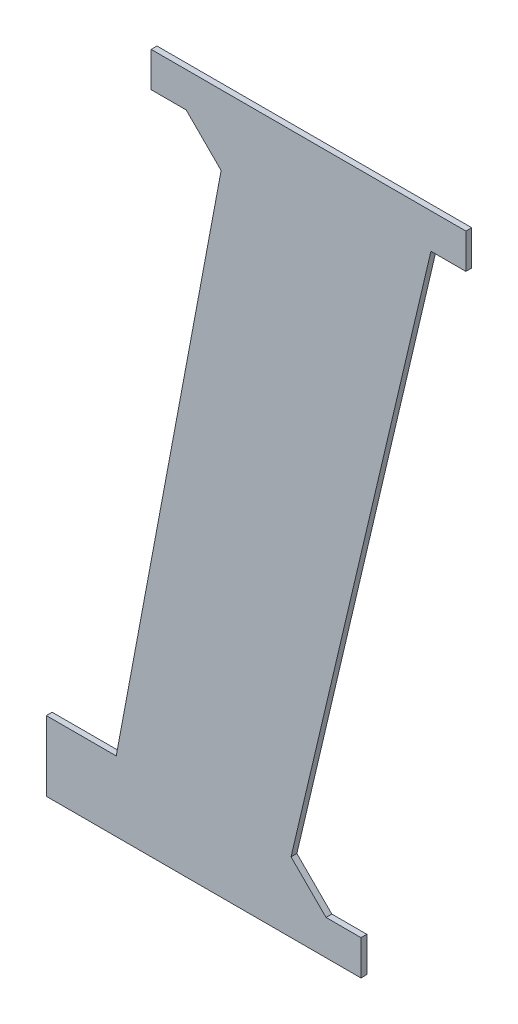
ISO-10303-21;
HEADER;
FILE_DESCRIPTION(('STEP AP214'),'2;1');
FILE_NAME('part.step','',(''),(''),'','','');
FILE_SCHEMA(('AUTOMOTIVE_DESIGN { 1 0 10303 214 1 1 1 1 }'));
ENDSEC;
DATA;
#1=APPLICATION_CONTEXT('core data for automotive mechanical design processes');
#2=APPLICATION_PROTOCOL_DEFINITION('international standard','automotive_design',2000,#1);
#3=PRODUCT_CONTEXT('',#1,'mechanical');
#4=PRODUCT('Part','Part','',(#3));
#5=PRODUCT_RELATED_PRODUCT_CATEGORY('part','',(#4));
#6=PRODUCT_DEFINITION_FORMATION('','',#4);
#7=PRODUCT_DEFINITION_CONTEXT('part definition',#1,'design');
#8=PRODUCT_DEFINITION('design','',#6,#7);
#9=PRODUCT_DEFINITION_SHAPE('','',#8);
#10=(LENGTH_UNIT() NAMED_UNIT(*) SI_UNIT(.MILLI.,.METRE.));
#11=(NAMED_UNIT(*) PLANE_ANGLE_UNIT() SI_UNIT($,.RADIAN.));
#12=(NAMED_UNIT(*) SI_UNIT($,.STERADIAN.) SOLID_ANGLE_UNIT());
#13=UNCERTAINTY_MEASURE_WITH_UNIT(LENGTH_MEASURE(1.E-05),#10,'distance_accuracy_value','');
#14=(GEOMETRIC_REPRESENTATION_CONTEXT(3) GLOBAL_UNCERTAINTY_ASSIGNED_CONTEXT((#13)) GLOBAL_UNIT_ASSIGNED_CONTEXT((#10,
#11,#12)) REPRESENTATION_CONTEXT('',''));
#15=CARTESIAN_POINT('',(0.,0.,0.));
#16=DIRECTION('',(0.,0.,1.));
#17=DIRECTION('',(1.,0.,0.));
#18=AXIS2_PLACEMENT_3D('',#15,#16,#17);
#19=CARTESIAN_POINT('',(-0.17999964,0.60000134,0.01));
#20=DIRECTION('',(0.,0.,1.));
#21=DIRECTION('',(1.,0.,0.));
#22=AXIS2_PLACEMENT_3D('',#19,#20,#21);
#23=PLANE('',#22);
#24=DIRECTION('',(0.,1.,0.));
#25=VECTOR('',#24,1.);
#26=CARTESIAN_POINT('',(0.36000182,0.60000134,0.01));
#27=LINE('',#26,#25);
#28=CARTESIAN_POINT('',(0.36000182,0.60000134,0.01));
#29=VERTEX_POINT('',#28);
#30=CARTESIAN_POINT('',(0.36000182,0.53999892,0.01));
#31=VERTEX_POINT('',#30);
#32=EDGE_CURVE('E177',#29,#31,#27,.F.);
#33=ORIENTED_EDGE('',*,*,#32,.F.);
#34=DIRECTION('',(1.,0.,0.));
#35=VECTOR('',#34,1.);
#36=CARTESIAN_POINT('',(-0.17999964,0.60000134,0.01));
#37=LINE('',#36,#35);
#38=CARTESIAN_POINT('',(-0.17999964,0.60000134,0.01));
#39=VERTEX_POINT('',#38);
#40=EDGE_CURVE('E130',#39,#29,#37,.T.);
#41=ORIENTED_EDGE('',*,*,#40,.F.);
#42=DIRECTION('',(0.,1.,0.));
#43=VECTOR('',#42,1.);
#44=CARTESIAN_POINT('',(-0.17999964,0.53999892,0.01));
#45=LINE('',#44,#43);
#46=CARTESIAN_POINT('',(-0.17999964,0.53999892,0.01));
#47=VERTEX_POINT('',#46);
#48=EDGE_CURVE('E20',#47,#39,#45,.T.);
#49=ORIENTED_EDGE('',*,*,#48,.F.);
#50=DIRECTION('',(1.,0.,0.));
#51=VECTOR('',#50,1.);
#52=CARTESIAN_POINT('',(-0.11999976,0.53999892,0.01));
#53=LINE('',#52,#51);
#54=CARTESIAN_POINT('',(-0.119999759999996,0.539998920000004,0.01));
#55=VERTEX_POINT('',#54);
#56=EDGE_CURVE('E119',#55,#47,#53,.F.);
#57=ORIENTED_EDGE('',*,*,#56,.F.);
#58=DIRECTION('',(0.707121747834652,-0.707091814221652,0.));
#59=VECTOR('',#58,1.);
#60=CARTESIAN_POINT('',(-0.05999734,0.47999904,0.01));
#61=LINE('',#60,#59);
#62=CARTESIAN_POINT('',(-0.0599973400000875,0.479999040000016,0.01));
#63=VERTEX_POINT('',#62);
#64=EDGE_CURVE('E114',#63,#55,#61,.F.);
#65=ORIENTED_EDGE('',*,*,#64,.F.);
#66=DIRECTION('',(-0.184290576207041,-0.982871804215218,0.));
#67=VECTOR('',#66,1.);
#68=CARTESIAN_POINT('',(-0.23999952,-0.48000158,0.01));
#69=LINE('',#68,#67);
#70=CARTESIAN_POINT('',(-0.23999952,-0.48000158,0.01));
#71=VERTEX_POINT('',#70);
#72=EDGE_CURVE('E141',#71,#63,#69,.F.);
#73=ORIENTED_EDGE('',*,*,#72,.F.);
#74=DIRECTION('',(1.,0.,0.));
#75=VECTOR('',#74,1.);
#76=CARTESIAN_POINT('',(-0.35999928,-0.48000158,0.01));
#77=LINE('',#76,#75);
#78=CARTESIAN_POINT('',(-0.35999928,-0.48000158,0.01));
#79=VERTEX_POINT('',#78);
#80=EDGE_CURVE('E145',#79,#71,#77,.T.);
#81=ORIENTED_EDGE('',*,*,#80,.F.);
#82=DIRECTION('',(0.,1.,0.));
#83=VECTOR('',#82,1.);
#84=CARTESIAN_POINT('',(-0.35999928,-0.60000134,0.01));
#85=LINE('',#84,#83);
#86=CARTESIAN_POINT('',(-0.35999928,-0.60000134,0.01));
#87=VERTEX_POINT('',#86);
#88=EDGE_CURVE('E149',#87,#79,#85,.T.);
#89=ORIENTED_EDGE('',*,*,#88,.F.);
#90=DIRECTION('',(1.,0.,0.));
#91=VECTOR('',#90,1.);
#92=CARTESIAN_POINT('',(0.18000218,-0.60000134,0.01));
#93=LINE('',#92,#91);
#94=CARTESIAN_POINT('',(0.18000218,-0.60000134,0.01));
#95=VERTEX_POINT('',#94);
#96=EDGE_CURVE('E153',#95,#87,#93,.F.);
#97=ORIENTED_EDGE('',*,*,#96,.F.);
#98=DIRECTION('',(0.,1.,0.));
#99=VECTOR('',#98,1.);
#100=CARTESIAN_POINT('',(0.18000218,-0.54000146,0.01));
#101=LINE('',#100,#99);
#102=CARTESIAN_POINT('',(0.18000218,-0.54000146,0.01));
#103=VERTEX_POINT('',#102);
#104=EDGE_CURVE('E157',#103,#95,#101,.F.);
#105=ORIENTED_EDGE('',*,*,#104,.F.);
#106=DIRECTION('',(1.,0.,0.));
#107=VECTOR('',#106,1.);
#108=CARTESIAN_POINT('',(0.1200023,-0.54000146,0.01));
#109=LINE('',#108,#107);
#110=CARTESIAN_POINT('',(0.1200023,-0.54000146,0.01));
#111=VERTEX_POINT('',#110);
#112=EDGE_CURVE('E161',#111,#103,#109,.T.);
#113=ORIENTED_EDGE('',*,*,#112,.F.);
#114=DIRECTION('',(-0.707106781186548,0.707106781186548,0.));
#115=VECTOR('',#114,1.);
#116=CARTESIAN_POINT('',(0.06000242,-0.48000158,0.01));
#117=LINE('',#116,#115);
#118=CARTESIAN_POINT('',(0.0600024200000004,-0.48000158,0.01));
#119=VERTEX_POINT('',#118);
#120=EDGE_CURVE('E165',#119,#111,#117,.F.);
#121=ORIENTED_EDGE('',*,*,#120,.F.);
#122=DIRECTION('',(0.229038793293004,0.973417295494016,0.));
#123=VECTOR('',#122,1.);
#124=CARTESIAN_POINT('',(0.30000194,0.53999892,0.01));
#125=LINE('',#124,#123);
#126=CARTESIAN_POINT('',(0.30000194,0.53999892,0.01));
#127=VERTEX_POINT('',#126);
#128=EDGE_CURVE('E169',#127,#119,#125,.F.);
#129=ORIENTED_EDGE('',*,*,#128,.F.);
#130=DIRECTION('',(1.,0.,0.));
#131=VECTOR('',#130,1.);
#132=CARTESIAN_POINT('',(0.36000182,0.53999892,0.01));
#133=LINE('',#132,#131);
#134=EDGE_CURVE('E173',#31,#127,#133,.F.);
#135=ORIENTED_EDGE('',*,*,#134,.F.);
#136=EDGE_LOOP('',(#33,#41,#49,#57,#65,#73,#81,#89,#97,#105,#113,#121,#129,#135));
#137=FACE_BOUND('',#136,.T.);
#138=ADVANCED_FACE('F17',(#137),#23,.T.);
#139=CARTESIAN_POINT('',(-0.17999964,0.53999892,0.));
#140=DIRECTION('',(-1.,0.,0.));
#141=DIRECTION('',(0.,0.,1.));
#142=AXIS2_PLACEMENT_3D('',#139,#140,#141);
#143=PLANE('',#142);
#144=DIRECTION('',(0.,0.,1.));
#145=VECTOR('',#144,1.);
#146=CARTESIAN_POINT('',(-0.17999964,0.60000134,0.));
#147=LINE('',#146,#145);
#148=CARTESIAN_POINT('',(-0.17999964,0.60000134,0.));
#149=VERTEX_POINT('',#148);
#150=EDGE_CURVE('E181',#149,#39,#147,.T.);
#151=ORIENTED_EDGE('',*,*,#150,.F.);
#152=DIRECTION('',(0.,1.,0.));
#153=VECTOR('',#152,1.);
#154=CARTESIAN_POINT('',(-0.17999964,0.60000134,0.));
#155=LINE('',#154,#153);
#156=CARTESIAN_POINT('',(-0.17999964,0.53999892,0.));
#157=VERTEX_POINT('',#156);
#158=EDGE_CURVE('E136',#149,#157,#155,.F.);
#159=ORIENTED_EDGE('',*,*,#158,.T.);
#160=DIRECTION('',(0.,0.,-1.));
#161=VECTOR('',#160,1.);
#162=CARTESIAN_POINT('',(-0.17999964,0.53999892,0.));
#163=LINE('',#162,#161);
#164=EDGE_CURVE('E124',#47,#157,#163,.T.);
#165=ORIENTED_EDGE('',*,*,#164,.F.);
#166=ORIENTED_EDGE('',*,*,#48,.T.);
#167=EDGE_LOOP('',(#151,#159,#165,#166));
#168=FACE_BOUND('',#167,.T.);
#169=ADVANCED_FACE('F135',(#168),#143,.T.);
#170=CARTESIAN_POINT('',(-0.11999976,0.53999892,0.));
#171=DIRECTION('',(0.,-1.,0.));
#172=DIRECTION('',(0.,0.,-1.));
#173=AXIS2_PLACEMENT_3D('',#170,#171,#172);
#174=PLANE('',#173);
#175=ORIENTED_EDGE('',*,*,#164,.T.);
#176=DIRECTION('',(1.,0.,0.));
#177=VECTOR('',#176,1.);
#178=CARTESIAN_POINT('',(-0.17999964,0.53999892,0.));
#179=LINE('',#178,#177);
#180=CARTESIAN_POINT('',(-0.119999759999996,0.539998920000004,0.));
#181=VERTEX_POINT('',#180);
#182=EDGE_CURVE('E186',#157,#181,#179,.T.);
#183=ORIENTED_EDGE('',*,*,#182,.T.);
#184=DIRECTION('',(0.,0.,1.));
#185=VECTOR('',#184,1.);
#186=CARTESIAN_POINT('',(-0.119999759999986,0.539998920000014,0.));
#187=LINE('',#186,#185);
#188=EDGE_CURVE('E126',#55,#181,#187,.F.);
#189=ORIENTED_EDGE('',*,*,#188,.F.);
#190=ORIENTED_EDGE('',*,*,#56,.T.);
#191=EDGE_LOOP('',(#175,#183,#189,#190));
#192=FACE_BOUND('',#191,.T.);
#193=ADVANCED_FACE('F121',(#192),#174,.T.);
#194=CARTESIAN_POINT('',(-0.05999734,0.47999904,0.));
#195=DIRECTION('',(-0.707091814221652,-0.707121747834652,0.));
#196=DIRECTION('',(0.707121747834652,-0.707091814221652,0.));
#197=AXIS2_PLACEMENT_3D('',#194,#195,#196);
#198=PLANE('',#197);
#199=ORIENTED_EDGE('',*,*,#188,.T.);
#200=DIRECTION('',(0.707121747834819,-0.707091814221484,0.));
#201=VECTOR('',#200,1.);
#202=CARTESIAN_POINT('',(-0.11999976,0.53999892,0.));
#203=LINE('',#202,#201);
#204=CARTESIAN_POINT('',(-0.0599973400000875,0.479999040000016,0.));
#205=VERTEX_POINT('',#204);
#206=EDGE_CURVE('E188',#181,#205,#203,.T.);
#207=ORIENTED_EDGE('',*,*,#206,.T.);
#208=DIRECTION('',(0.,0.,1.));
#209=VECTOR('',#208,1.);
#210=CARTESIAN_POINT('',(-0.0599973400003498,0.479999040000066,0.));
#211=LINE('',#210,#209);
#212=EDGE_CURVE('E143',#63,#205,#211,.F.);
#213=ORIENTED_EDGE('',*,*,#212,.F.);
#214=ORIENTED_EDGE('',*,*,#64,.T.);
#215=EDGE_LOOP('',(#199,#207,#213,#214));
#216=FACE_BOUND('',#215,.T.);
#217=ADVANCED_FACE('F270',(#216),#198,.T.);
#218=CARTESIAN_POINT('',(-0.23999952,-0.48000158,0.));
#219=DIRECTION('',(-0.982871804215218,0.184290576207041,0.));
#220=DIRECTION('',(-0.184290576207041,-0.982871804215218,0.));
#221=AXIS2_PLACEMENT_3D('',#218,#219,#220);
#222=PLANE('',#221);
#223=ORIENTED_EDGE('',*,*,#212,.T.);
#224=DIRECTION('',(-0.184290576207399,-0.98287180421515,0.));
#225=VECTOR('',#224,1.);
#226=CARTESIAN_POINT('',(-0.05999734,0.47999904,0.));
#227=LINE('',#226,#225);
#228=CARTESIAN_POINT('',(-0.23999952,-0.48000158,0.));
#229=VERTEX_POINT('',#228);
#230=EDGE_CURVE('E191',#205,#229,#227,.T.);
#231=ORIENTED_EDGE('',*,*,#230,.T.);
#232=DIRECTION('',(0.,0.,1.));
#233=VECTOR('',#232,1.);
#234=CARTESIAN_POINT('',(-0.23999952,-0.48000158,0.));
#235=LINE('',#234,#233);
#236=EDGE_CURVE('E147',#71,#229,#235,.F.);
#237=ORIENTED_EDGE('',*,*,#236,.F.);
#238=ORIENTED_EDGE('',*,*,#72,.T.);
#239=EDGE_LOOP('',(#223,#231,#237,#238));
#240=FACE_BOUND('',#239,.T.);
#241=ADVANCED_FACE('F269',(#240),#222,.T.);
#242=CARTESIAN_POINT('',(-0.35999928,-0.48000158,0.));
#243=DIRECTION('',(0.,1.,0.));
#244=DIRECTION('',(0.,0.,1.));
#245=AXIS2_PLACEMENT_3D('',#242,#243,#244);
#246=PLANE('',#245);
#247=ORIENTED_EDGE('',*,*,#236,.T.);
#248=DIRECTION('',(1.,0.,0.));
#249=VECTOR('',#248,1.);
#250=CARTESIAN_POINT('',(-0.17999964,-0.48000158,0.));
#251=LINE('',#250,#249);
#252=CARTESIAN_POINT('',(-0.35999928,-0.48000158,0.));
#253=VERTEX_POINT('',#252);
#254=EDGE_CURVE('E194',#229,#253,#251,.F.);
#255=ORIENTED_EDGE('',*,*,#254,.T.);
#256=DIRECTION('',(0.,0.,1.));
#257=VECTOR('',#256,1.);
#258=CARTESIAN_POINT('',(-0.35999928,-0.48000158,0.));
#259=LINE('',#258,#257);
#260=EDGE_CURVE('E151',#79,#253,#259,.F.);
#261=ORIENTED_EDGE('',*,*,#260,.F.);
#262=ORIENTED_EDGE('',*,*,#80,.T.);
#263=EDGE_LOOP('',(#247,#255,#261,#262));
#264=FACE_BOUND('',#263,.T.);
#265=ADVANCED_FACE('F263',(#264),#246,.T.);
#266=CARTESIAN_POINT('',(-0.35999928,-0.60000134,0.));
#267=DIRECTION('',(-1.,0.,0.));
#268=DIRECTION('',(0.,0.,1.));
#269=AXIS2_PLACEMENT_3D('',#266,#267,#268);
#270=PLANE('',#269);
#271=ORIENTED_EDGE('',*,*,#260,.T.);
#272=DIRECTION('',(0.,1.,0.));
#273=VECTOR('',#272,1.);
#274=CARTESIAN_POINT('',(-0.35999928,0.60000134,0.));
#275=LINE('',#274,#273);
#276=CARTESIAN_POINT('',(-0.35999928,-0.60000134,0.));
#277=VERTEX_POINT('',#276);
#278=EDGE_CURVE('E197',#253,#277,#275,.F.);
#279=ORIENTED_EDGE('',*,*,#278,.T.);
#280=DIRECTION('',(0.,0.,-1.));
#281=VECTOR('',#280,1.);
#282=CARTESIAN_POINT('',(-0.35999928,-0.60000134,0.));
#283=LINE('',#282,#281);
#284=EDGE_CURVE('E155',#87,#277,#283,.T.);
#285=ORIENTED_EDGE('',*,*,#284,.F.);
#286=ORIENTED_EDGE('',*,*,#88,.T.);
#287=EDGE_LOOP('',(#271,#279,#285,#286));
#288=FACE_BOUND('',#287,.T.);
#289=ADVANCED_FACE('F259',(#288),#270,.T.);
#290=CARTESIAN_POINT('',(0.18000218,-0.60000134,0.));
#291=DIRECTION('',(0.,-1.,0.));
#292=DIRECTION('',(0.,0.,-1.));
#293=AXIS2_PLACEMENT_3D('',#290,#291,#292);
#294=PLANE('',#293);
#295=ORIENTED_EDGE('',*,*,#284,.T.);
#296=DIRECTION('',(1.,0.,0.));
#297=VECTOR('',#296,1.);
#298=CARTESIAN_POINT('',(-0.17999964,-0.60000134,0.));
#299=LINE('',#298,#297);
#300=CARTESIAN_POINT('',(0.18000218,-0.60000134,0.));
#301=VERTEX_POINT('',#300);
#302=EDGE_CURVE('E200',#277,#301,#299,.T.);
#303=ORIENTED_EDGE('',*,*,#302,.T.);
#304=DIRECTION('',(0.,0.,-1.));
#305=VECTOR('',#304,1.);
#306=CARTESIAN_POINT('',(0.18000218,-0.60000134,0.));
#307=LINE('',#306,#305);
#308=EDGE_CURVE('E159',#95,#301,#307,.T.);
#309=ORIENTED_EDGE('',*,*,#308,.F.);
#310=ORIENTED_EDGE('',*,*,#96,.T.);
#311=EDGE_LOOP('',(#295,#303,#309,#310));
#312=FACE_BOUND('',#311,.T.);
#313=ADVANCED_FACE('F253',(#312),#294,.T.);
#314=CARTESIAN_POINT('',(0.18000218,-0.54000146,0.));
#315=DIRECTION('',(1.,0.,0.));
#316=DIRECTION('',(0.,0.,-1.));
#317=AXIS2_PLACEMENT_3D('',#314,#315,#316);
#318=PLANE('',#317);
#319=ORIENTED_EDGE('',*,*,#308,.T.);
#320=DIRECTION('',(0.,1.,0.));
#321=VECTOR('',#320,1.);
#322=CARTESIAN_POINT('',(0.18000218,0.60000134,0.));
#323=LINE('',#322,#321);
#324=CARTESIAN_POINT('',(0.18000218,-0.54000146,0.));
#325=VERTEX_POINT('',#324);
#326=EDGE_CURVE('E203',#301,#325,#323,.T.);
#327=ORIENTED_EDGE('',*,*,#326,.T.);
#328=DIRECTION('',(0.,0.,1.));
#329=VECTOR('',#328,1.);
#330=CARTESIAN_POINT('',(0.18000218,-0.54000146,0.));
#331=LINE('',#330,#329);
#332=EDGE_CURVE('E163',#103,#325,#331,.F.);
#333=ORIENTED_EDGE('',*,*,#332,.F.);
#334=ORIENTED_EDGE('',*,*,#104,.T.);
#335=EDGE_LOOP('',(#319,#327,#333,#334));
#336=FACE_BOUND('',#335,.T.);
#337=ADVANCED_FACE('F249',(#336),#318,.T.);
#338=CARTESIAN_POINT('',(0.1200023,-0.54000146,0.));
#339=DIRECTION('',(0.,1.,0.));
#340=DIRECTION('',(0.,0.,1.));
#341=AXIS2_PLACEMENT_3D('',#338,#339,#340);
#342=PLANE('',#341);
#343=ORIENTED_EDGE('',*,*,#332,.T.);
#344=DIRECTION('',(1.,0.,0.));
#345=VECTOR('',#344,1.);
#346=CARTESIAN_POINT('',(-0.17999964,-0.54000146,0.));
#347=LINE('',#346,#345);
#348=CARTESIAN_POINT('',(0.1200023,-0.54000146,0.));
#349=VERTEX_POINT('',#348);
#350=EDGE_CURVE('E206',#325,#349,#347,.F.);
#351=ORIENTED_EDGE('',*,*,#350,.T.);
#352=DIRECTION('',(0.,0.,1.));
#353=VECTOR('',#352,1.);
#354=CARTESIAN_POINT('',(0.1200023,-0.54000146,0.));
#355=LINE('',#354,#353);
#356=EDGE_CURVE('E167',#111,#349,#355,.F.);
#357=ORIENTED_EDGE('',*,*,#356,.F.);
#358=ORIENTED_EDGE('',*,*,#112,.T.);
#359=EDGE_LOOP('',(#343,#351,#357,#358));
#360=FACE_BOUND('',#359,.T.);
#361=ADVANCED_FACE('F243',(#360),#342,.T.);
#362=CARTESIAN_POINT('',(0.06000242,-0.48000158,0.));
#363=DIRECTION('',(0.707106781186548,0.707106781186548,0.));
#364=DIRECTION('',(-0.707106781186548,0.707106781186548,0.));
#365=AXIS2_PLACEMENT_3D('',#362,#363,#364);
#366=PLANE('',#365);
#367=ORIENTED_EDGE('',*,*,#356,.T.);
#368=DIRECTION('',(-0.707106781186547,0.707106781186547,0.));
#369=VECTOR('',#368,1.);
#370=CARTESIAN_POINT('',(0.1200023,-0.54000146,0.));
#371=LINE('',#370,#369);
#372=CARTESIAN_POINT('',(0.0600024200000004,-0.48000158,0.));
#373=VERTEX_POINT('',#372);
#374=EDGE_CURVE('E209',#349,#373,#371,.T.);
#375=ORIENTED_EDGE('',*,*,#374,.T.);
#376=DIRECTION('',(0.,0.,1.));
#377=VECTOR('',#376,1.);
#378=CARTESIAN_POINT('',(0.0600024200000015,-0.48000158,0.));
#379=LINE('',#378,#377);
#380=EDGE_CURVE('E171',#119,#373,#379,.F.);
#381=ORIENTED_EDGE('',*,*,#380,.F.);
#382=ORIENTED_EDGE('',*,*,#120,.T.);
#383=EDGE_LOOP('',(#367,#375,#381,#382));
#384=FACE_BOUND('',#383,.T.);
#385=ADVANCED_FACE('F239',(#384),#366,.T.);
#386=CARTESIAN_POINT('',(0.30000194,0.53999892,0.));
#387=DIRECTION('',(0.973417295494016,-0.229038793293004,0.));
#388=DIRECTION('',(0.229038793293004,0.973417295494016,0.));
#389=AXIS2_PLACEMENT_3D('',#386,#387,#388);
#390=PLANE('',#389);
#391=ORIENTED_EDGE('',*,*,#380,.T.);
#392=DIRECTION('',(0.229038793293005,0.973417295494016,0.));
#393=VECTOR('',#392,1.);
#394=CARTESIAN_POINT('',(0.06000242,-0.48000158,0.));
#395=LINE('',#394,#393);
#396=CARTESIAN_POINT('',(0.30000194,0.53999892,0.));
#397=VERTEX_POINT('',#396);
#398=EDGE_CURVE('E212',#373,#397,#395,.T.);
#399=ORIENTED_EDGE('',*,*,#398,.T.);
#400=DIRECTION('',(0.,0.,-1.));
#401=VECTOR('',#400,1.);
#402=CARTESIAN_POINT('',(0.30000194,0.53999892,0.));
#403=LINE('',#402,#401);
#404=EDGE_CURVE('E175',#127,#397,#403,.T.);
#405=ORIENTED_EDGE('',*,*,#404,.F.);
#406=ORIENTED_EDGE('',*,*,#128,.T.);
#407=EDGE_LOOP('',(#391,#399,#405,#406));
#408=FACE_BOUND('',#407,.T.);
#409=ADVANCED_FACE('F233',(#408),#390,.T.);
#410=CARTESIAN_POINT('',(0.36000182,0.53999892,0.));
#411=DIRECTION('',(0.,-1.,0.));
#412=DIRECTION('',(0.,0.,-1.));
#413=AXIS2_PLACEMENT_3D('',#410,#411,#412);
#414=PLANE('',#413);
#415=ORIENTED_EDGE('',*,*,#404,.T.);
#416=DIRECTION('',(1.,0.,0.));
#417=VECTOR('',#416,1.);
#418=CARTESIAN_POINT('',(-0.17999964,0.53999892,0.));
#419=LINE('',#418,#417);
#420=CARTESIAN_POINT('',(0.36000182,0.53999892,0.));
#421=VERTEX_POINT('',#420);
#422=EDGE_CURVE('E215',#397,#421,#419,.T.);
#423=ORIENTED_EDGE('',*,*,#422,.T.);
#424=DIRECTION('',(0.,0.,-1.));
#425=VECTOR('',#424,1.);
#426=CARTESIAN_POINT('',(0.36000182,0.53999892,0.));
#427=LINE('',#426,#425);
#428=EDGE_CURVE('E179',#31,#421,#427,.T.);
#429=ORIENTED_EDGE('',*,*,#428,.F.);
#430=ORIENTED_EDGE('',*,*,#134,.T.);
#431=EDGE_LOOP('',(#415,#423,#429,#430));
#432=FACE_BOUND('',#431,.T.);
#433=ADVANCED_FACE('F228',(#432),#414,.T.);
#434=CARTESIAN_POINT('',(0.36000182,0.60000134,0.));
#435=DIRECTION('',(1.,0.,0.));
#436=DIRECTION('',(0.,0.,-1.));
#437=AXIS2_PLACEMENT_3D('',#434,#435,#436);
#438=PLANE('',#437);
#439=ORIENTED_EDGE('',*,*,#428,.T.);
#440=DIRECTION('',(0.,1.,0.));
#441=VECTOR('',#440,1.);
#442=CARTESIAN_POINT('',(0.36000182,0.60000134,0.));
#443=LINE('',#442,#441);
#444=CARTESIAN_POINT('',(0.36000182,0.60000134,0.));
#445=VERTEX_POINT('',#444);
#446=EDGE_CURVE('E26',#421,#445,#443,.T.);
#447=ORIENTED_EDGE('',*,*,#446,.T.);
#448=DIRECTION('',(0.,0.,1.));
#449=VECTOR('',#448,1.);
#450=CARTESIAN_POINT('',(0.36000182,0.60000134,0.));
#451=LINE('',#450,#449);
#452=EDGE_CURVE('E34',#29,#445,#451,.F.);
#453=ORIENTED_EDGE('',*,*,#452,.F.);
#454=ORIENTED_EDGE('',*,*,#32,.T.);
#455=EDGE_LOOP('',(#439,#447,#453,#454));
#456=FACE_BOUND('',#455,.T.);
#457=ADVANCED_FACE('F221',(#456),#438,.T.);
#458=CARTESIAN_POINT('',(-0.17999964,0.60000134,0.));
#459=DIRECTION('',(0.,1.,0.));
#460=DIRECTION('',(0.,0.,1.));
#461=AXIS2_PLACEMENT_3D('',#458,#459,#460);
#462=PLANE('',#461);
#463=ORIENTED_EDGE('',*,*,#452,.T.);
#464=DIRECTION('',(1.,0.,0.));
#465=VECTOR('',#464,1.);
#466=CARTESIAN_POINT('',(-0.17999964,0.60000134,0.));
#467=LINE('',#466,#465);
#468=EDGE_CURVE('E11',#445,#149,#467,.F.);
#469=ORIENTED_EDGE('',*,*,#468,.T.);
#470=ORIENTED_EDGE('',*,*,#150,.T.);
#471=ORIENTED_EDGE('',*,*,#40,.T.);
#472=EDGE_LOOP('',(#463,#469,#470,#471));
#473=FACE_BOUND('',#472,.T.);
#474=ADVANCED_FACE('F271',(#473),#462,.T.);
#475=CARTESIAN_POINT('',(-0.17999964,0.60000134,0.));
#476=DIRECTION('',(0.,0.,1.));
#477=DIRECTION('',(1.,0.,0.));
#478=AXIS2_PLACEMENT_3D('',#475,#476,#477);
#479=PLANE('',#478);
#480=ORIENTED_EDGE('',*,*,#446,.F.);
#481=ORIENTED_EDGE('',*,*,#422,.F.);
#482=ORIENTED_EDGE('',*,*,#398,.F.);
#483=ORIENTED_EDGE('',*,*,#374,.F.);
#484=ORIENTED_EDGE('',*,*,#350,.F.);
#485=ORIENTED_EDGE('',*,*,#326,.F.);
#486=ORIENTED_EDGE('',*,*,#302,.F.);
#487=ORIENTED_EDGE('',*,*,#278,.F.);
#488=ORIENTED_EDGE('',*,*,#254,.F.);
#489=ORIENTED_EDGE('',*,*,#230,.F.);
#490=ORIENTED_EDGE('',*,*,#206,.F.);
#491=ORIENTED_EDGE('',*,*,#182,.F.);
#492=ORIENTED_EDGE('',*,*,#158,.F.);
#493=ORIENTED_EDGE('',*,*,#468,.F.);
#494=EDGE_LOOP('',(#480,#481,#482,#483,#484,#485,#486,#487,#488,#489,#490,#491,#492,#493));
#495=FACE_BOUND('',#494,.T.);
#496=ADVANCED_FACE('F225',(#495),#479,.F.);
#497=CLOSED_SHELL('',(#138,#169,#193,#217,#241,#265,#289,#313,#337,#361,#385,#409,#433,#457,
#474,#496));
#498=MANIFOLD_SOLID_BREP('B1',#497);
#499=ADVANCED_BREP_SHAPE_REPRESENTATION('',(#18,#498),#14);
#500=SHAPE_DEFINITION_REPRESENTATION(#9,#499);
ENDSEC;
END-ISO-10303-21;
